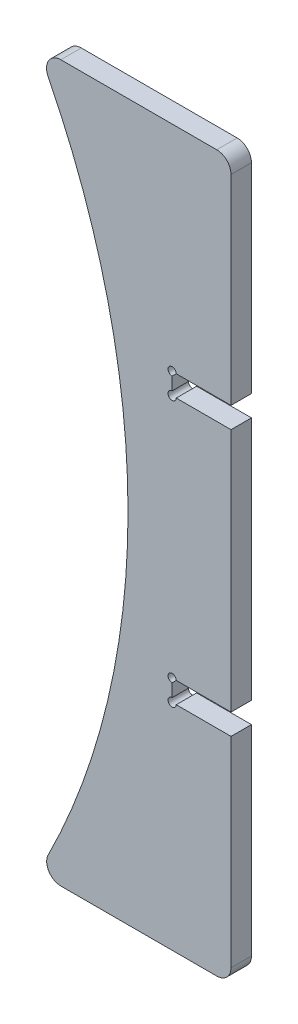
ISO-10303-21;
HEADER;
FILE_DESCRIPTION(('STEP AP214'),'2;1');
FILE_NAME('part.step','',(''),(''),'','','');
FILE_SCHEMA(('AUTOMOTIVE_DESIGN { 1 0 10303 214 1 1 1 1 }'));
ENDSEC;
DATA;
#1=APPLICATION_CONTEXT('core data for automotive mechanical design processes');
#2=APPLICATION_PROTOCOL_DEFINITION('international standard','automotive_design',2000,#1);
#3=PRODUCT_CONTEXT('',#1,'mechanical');
#4=PRODUCT('Part','Part','',(#3));
#5=PRODUCT_RELATED_PRODUCT_CATEGORY('part','',(#4));
#6=PRODUCT_DEFINITION_FORMATION('','',#4);
#7=PRODUCT_DEFINITION_CONTEXT('part definition',#1,'design');
#8=PRODUCT_DEFINITION('design','',#6,#7);
#9=PRODUCT_DEFINITION_SHAPE('','',#8);
#10=(LENGTH_UNIT() NAMED_UNIT(*) SI_UNIT(.MILLI.,.METRE.));
#11=(NAMED_UNIT(*) PLANE_ANGLE_UNIT() SI_UNIT($,.RADIAN.));
#12=(NAMED_UNIT(*) SI_UNIT($,.STERADIAN.) SOLID_ANGLE_UNIT());
#13=UNCERTAINTY_MEASURE_WITH_UNIT(LENGTH_MEASURE(1.E-05),#10,'distance_accuracy_value','');
#14=(GEOMETRIC_REPRESENTATION_CONTEXT(3) GLOBAL_UNCERTAINTY_ASSIGNED_CONTEXT((#13)) GLOBAL_UNIT_ASSIGNED_CONTEXT((#10,
#11,#12)) REPRESENTATION_CONTEXT('',''));
#15=CARTESIAN_POINT('',(0.,0.,0.));
#16=DIRECTION('',(0.,0.,1.));
#17=DIRECTION('',(1.,0.,0.));
#18=AXIS2_PLACEMENT_3D('',#15,#16,#17);
#19=CARTESIAN_POINT('',(-5.22263123628082,117.808229797163,-5.));
#20=DIRECTION('',(0.,0.,1.));
#21=DIRECTION('',(1.,0.,0.));
#22=AXIS2_PLACEMENT_3D('',#19,#20,#21);
#23=CYLINDRICAL_SURFACE('',#22,3.5);
#24=CARTESIAN_POINT('',(-5.22263123628082,117.808229797163,0.));
#25=DIRECTION('',(0.,0.,1.));
#26=DIRECTION('',(1.,0.,0.));
#27=AXIS2_PLACEMENT_3D('',#24,#25,#26);
#28=CIRCLE('',#27,3.5);
#29=CARTESIAN_POINT('',(-1.72263123628082,117.808229797163,0.));
#30=VERTEX_POINT('',#29);
#31=CARTESIAN_POINT('',(-5.22263123628082,121.308229797163,0.));
#32=VERTEX_POINT('',#31);
#33=EDGE_CURVE('E241',#30,#32,#28,.T.);
#34=ORIENTED_EDGE('',*,*,#33,.F.);
#35=DIRECTION('',(0.,0.,1.));
#36=VECTOR('',#35,1.);
#37=CARTESIAN_POINT('',(-1.72263123628082,117.808229797163,-5.));
#38=LINE('',#37,#36);
#39=CARTESIAN_POINT('',(-1.72263123628082,117.808229797163,-5.));
#40=VERTEX_POINT('',#39);
#41=EDGE_CURVE('E11',#40,#30,#38,.T.);
#42=ORIENTED_EDGE('',*,*,#41,.F.);
#43=CARTESIAN_POINT('',(-5.22263123628082,117.808229797163,-5.));
#44=DIRECTION('',(0.,0.,1.));
#45=DIRECTION('',(1.,0.,0.));
#46=AXIS2_PLACEMENT_3D('',#43,#44,#45);
#47=CIRCLE('',#46,3.5);
#48=CARTESIAN_POINT('',(-5.22263123628082,121.308229797163,-5.));
#49=VERTEX_POINT('',#48);
#50=EDGE_CURVE('E203',#40,#49,#47,.T.);
#51=ORIENTED_EDGE('',*,*,#50,.T.);
#52=DIRECTION('',(0.,0.,1.));
#53=VECTOR('',#52,1.);
#54=CARTESIAN_POINT('',(-5.22263123628082,121.308229797163,-5.));
#55=LINE('',#54,#53);
#56=EDGE_CURVE('E40',#49,#32,#55,.T.);
#57=ORIENTED_EDGE('',*,*,#56,.T.);
#58=EDGE_LOOP('',(#34,#42,#51,#57));
#59=FACE_BOUND('',#58,.T.);
#60=ADVANCED_FACE('F37',(#59),#23,.T.);
#61=CARTESIAN_POINT('',(-1.72263123628082,117.808229797163,-5.));
#62=DIRECTION('',(1.,0.,0.));
#63=DIRECTION('',(0.,1.,0.));
#64=AXIS2_PLACEMENT_3D('',#61,#62,#63);
#65=PLANE('',#64);
#66=DIRECTION('',(0.,1.,0.));
#67=VECTOR('',#66,1.);
#68=CARTESIAN_POINT('',(-1.72263123628082,117.808229797163,0.));
#69=LINE('',#68,#67);
#70=CARTESIAN_POINT('',(-1.72263123628056,68.8832302590771,0.));
#71=VERTEX_POINT('',#70);
#72=EDGE_CURVE('E196',#71,#30,#69,.T.);
#73=ORIENTED_EDGE('',*,*,#72,.F.);
#74=DIRECTION('',(0.,0.,1.));
#75=VECTOR('',#74,1.);
#76=CARTESIAN_POINT('',(-1.72263123628056,68.8832302590771,-5.));
#77=LINE('',#76,#75);
#78=CARTESIAN_POINT('',(-1.72263123628056,68.8832302590771,-5.));
#79=VERTEX_POINT('',#78);
#80=EDGE_CURVE('E45',#79,#71,#77,.T.);
#81=ORIENTED_EDGE('',*,*,#80,.F.);
#82=DIRECTION('',(0.,1.,0.));
#83=VECTOR('',#82,1.);
#84=CARTESIAN_POINT('',(-1.72263123628082,117.808229797163,-5.));
#85=LINE('',#84,#83);
#86=EDGE_CURVE('E228',#79,#40,#85,.T.);
#87=ORIENTED_EDGE('',*,*,#86,.T.);
#88=ORIENTED_EDGE('',*,*,#41,.T.);
#89=EDGE_LOOP('',(#73,#81,#87,#88));
#90=FACE_BOUND('',#89,.T.);
#91=ADVANCED_FACE('F368',(#90),#65,.T.);
#92=CARTESIAN_POINT('',(-1.72263123628056,68.8832302590771,-5.));
#93=DIRECTION('',(0.,-1.,0.));
#94=DIRECTION('',(0.,0.,-1.));
#95=AXIS2_PLACEMENT_3D('',#92,#93,#94);
#96=PLANE('',#95);
#97=DIRECTION('',(0.,0.,1.));
#98=VECTOR('',#97,1.);
#99=CARTESIAN_POINT('',(-15.1382280346836,68.8832302590771,-5.001));
#100=LINE('',#99,#98);
#101=CARTESIAN_POINT('',(-15.1382280346836,68.8832302590771,0.));
#102=VERTEX_POINT('',#101);
#103=CARTESIAN_POINT('',(-15.1382280346836,68.8832302590771,-5.));
#104=VERTEX_POINT('',#103);
#105=EDGE_CURVE('E53',#102,#104,#100,.F.);
#106=ORIENTED_EDGE('',*,*,#105,.T.);
#107=DIRECTION('',(1.,0.,0.));
#108=VECTOR('',#107,1.);
#109=CARTESIAN_POINT('',(-1.72263123628056,68.8832302590771,-5.));
#110=LINE('',#109,#108);
#111=EDGE_CURVE('E233',#104,#79,#110,.T.);
#112=ORIENTED_EDGE('',*,*,#111,.T.);
#113=ORIENTED_EDGE('',*,*,#80,.T.);
#114=DIRECTION('',(1.,0.,0.));
#115=VECTOR('',#114,1.);
#116=CARTESIAN_POINT('',(-1.72263123628056,68.8832302590771,0.));
#117=LINE('',#116,#115);
#118=EDGE_CURVE('E193',#102,#71,#117,.T.);
#119=ORIENTED_EDGE('',*,*,#118,.F.);
#120=EDGE_LOOP('',(#106,#112,#113,#119));
#121=FACE_BOUND('',#120,.T.);
#122=ADVANCED_FACE('F372',(#121),#96,.T.);
#123=CARTESIAN_POINT('',(-16.1382280346836,68.8832302590771,-5.));
#124=DIRECTION('',(1.,0.,0.));
#125=DIRECTION('',(0.,0.,-1.));
#126=AXIS2_PLACEMENT_3D('',#123,#124,#125);
#127=PLANE('',#126);
#128=DIRECTION('',(0.,0.,1.));
#129=VECTOR('',#128,1.);
#130=CARTESIAN_POINT('',(-16.1382280346836,67.8832302590771,-5.001));
#131=LINE('',#130,#129);
#132=CARTESIAN_POINT('',(-16.1382280346836,67.8832302590771,-5.));
#133=VERTEX_POINT('',#132);
#134=CARTESIAN_POINT('',(-16.1382280346836,67.8832302590771,0.));
#135=VERTEX_POINT('',#134);
#136=EDGE_CURVE('E174',#133,#135,#131,.T.);
#137=ORIENTED_EDGE('',*,*,#136,.T.);
#138=DIRECTION('',(0.,1.,0.));
#139=VECTOR('',#138,1.);
#140=CARTESIAN_POINT('',(-16.1382280346836,68.8832302590771,0.));
#141=LINE('',#140,#139);
#142=CARTESIAN_POINT('',(-16.1382280346836,64.7332302590771,0.));
#143=VERTEX_POINT('',#142);
#144=EDGE_CURVE('E185',#143,#135,#141,.T.);
#145=ORIENTED_EDGE('',*,*,#144,.F.);
#146=DIRECTION('',(0.,0.,1.));
#147=VECTOR('',#146,1.);
#148=CARTESIAN_POINT('',(-16.1382280346836,64.7332302590771,-5.001));
#149=LINE('',#148,#147);
#150=CARTESIAN_POINT('',(-16.1382280346836,64.7332302590771,-5.));
#151=VERTEX_POINT('',#150);
#152=EDGE_CURVE('E61',#143,#151,#149,.F.);
#153=ORIENTED_EDGE('',*,*,#152,.T.);
#154=DIRECTION('',(0.,1.,0.));
#155=VECTOR('',#154,1.);
#156=CARTESIAN_POINT('',(-16.1382280346836,68.8832302590771,-5.));
#157=LINE('',#156,#155);
#158=EDGE_CURVE('E187',#151,#133,#157,.T.);
#159=ORIENTED_EDGE('',*,*,#158,.T.);
#160=EDGE_LOOP('',(#137,#145,#153,#159));
#161=FACE_BOUND('',#160,.T.);
#162=ADVANCED_FACE('F184',(#161),#127,.T.);
#163=CARTESIAN_POINT('',(-16.1382280346836,63.7332302590771,-5.));
#164=DIRECTION('',(0.,1.,0.));
#165=DIRECTION('',(-1.,0.,0.));
#166=AXIS2_PLACEMENT_3D('',#163,#164,#165);
#167=PLANE('',#166);
#168=DIRECTION('',(0.,0.,1.));
#169=VECTOR('',#168,1.);
#170=CARTESIAN_POINT('',(-15.1382280346836,63.7332302590771,-5.001));
#171=LINE('',#170,#169);
#172=CARTESIAN_POINT('',(-15.1382280346836,63.7332302590771,-5.));
#173=VERTEX_POINT('',#172);
#174=CARTESIAN_POINT('',(-15.1382280346836,63.7332302590771,0.));
#175=VERTEX_POINT('',#174);
#176=EDGE_CURVE('E288',#173,#175,#171,.T.);
#177=ORIENTED_EDGE('',*,*,#176,.T.);
#178=DIRECTION('',(-1.,0.,0.));
#179=VECTOR('',#178,1.);
#180=CARTESIAN_POINT('',(-16.1382280346836,63.7332302590771,0.));
#181=LINE('',#180,#179);
#182=CARTESIAN_POINT('',(-1.72263123628056,63.7332302590771,0.));
#183=VERTEX_POINT('',#182);
#184=EDGE_CURVE('E194',#183,#175,#181,.T.);
#185=ORIENTED_EDGE('',*,*,#184,.F.);
#186=DIRECTION('',(0.,0.,1.));
#187=VECTOR('',#186,1.);
#188=CARTESIAN_POINT('',(-1.72263123628056,63.7332302590771,-5.));
#189=LINE('',#188,#187);
#190=CARTESIAN_POINT('',(-1.72263123628056,63.7332302590771,-5.));
#191=VERTEX_POINT('',#190);
#192=EDGE_CURVE('E207',#191,#183,#189,.T.);
#193=ORIENTED_EDGE('',*,*,#192,.F.);
#194=DIRECTION('',(-1.,0.,0.));
#195=VECTOR('',#194,1.);
#196=CARTESIAN_POINT('',(-16.1382280346836,63.7332302590771,-5.));
#197=LINE('',#196,#195);
#198=EDGE_CURVE('E289',#191,#173,#197,.T.);
#199=ORIENTED_EDGE('',*,*,#198,.T.);
#200=EDGE_LOOP('',(#177,#185,#193,#199));
#201=FACE_BOUND('',#200,.T.);
#202=ADVANCED_FACE('F287',(#201),#167,.T.);
#203=CARTESIAN_POINT('',(-1.72263123628056,63.7332302590771,-5.));
#204=DIRECTION('',(1.,0.,0.));
#205=DIRECTION('',(0.,1.,0.));
#206=AXIS2_PLACEMENT_3D('',#203,#204,#205);
#207=PLANE('',#206);
#208=DIRECTION('',(0.,1.,0.));
#209=VECTOR('',#208,1.);
#210=CARTESIAN_POINT('',(-1.72263123628056,63.7332302590771,0.));
#211=LINE('',#210,#209);
#212=CARTESIAN_POINT('',(-1.72263123628055,3.88322933520508,0.));
#213=VERTEX_POINT('',#212);
#214=EDGE_CURVE('E198',#213,#183,#211,.T.);
#215=ORIENTED_EDGE('',*,*,#214,.F.);
#216=DIRECTION('',(0.,0.,1.));
#217=VECTOR('',#216,1.);
#218=CARTESIAN_POINT('',(-1.72263123628055,3.88322933520508,-5.));
#219=LINE('',#218,#217);
#220=CARTESIAN_POINT('',(-1.72263123628055,3.88322933520508,-5.));
#221=VERTEX_POINT('',#220);
#222=EDGE_CURVE('E209',#221,#213,#219,.T.);
#223=ORIENTED_EDGE('',*,*,#222,.F.);
#224=DIRECTION('',(0.,1.,0.));
#225=VECTOR('',#224,1.);
#226=CARTESIAN_POINT('',(-1.72263123628056,63.7332302590771,-5.));
#227=LINE('',#226,#225);
#228=EDGE_CURVE('E282',#221,#191,#227,.T.);
#229=ORIENTED_EDGE('',*,*,#228,.T.);
#230=ORIENTED_EDGE('',*,*,#192,.T.);
#231=EDGE_LOOP('',(#215,#223,#229,#230));
#232=FACE_BOUND('',#231,.T.);
#233=ADVANCED_FACE('F279',(#232),#207,.T.);
#234=CARTESIAN_POINT('',(-1.72263123628055,3.88322933520508,-5.));
#235=DIRECTION('',(0.,-1.,0.));
#236=DIRECTION('',(1.,0.,0.));
#237=AXIS2_PLACEMENT_3D('',#234,#235,#236);
#238=PLANE('',#237);
#239=DIRECTION('',(0.,0.,1.));
#240=VECTOR('',#239,1.);
#241=CARTESIAN_POINT('',(-15.1382280346836,3.88322933520507,-5.001));
#242=LINE('',#241,#240);
#243=CARTESIAN_POINT('',(-15.1382280346836,3.88322933520507,0.));
#244=VERTEX_POINT('',#243);
#245=CARTESIAN_POINT('',(-15.1382280346836,3.88322933520507,-5.));
#246=VERTEX_POINT('',#245);
#247=EDGE_CURVE('E303',#244,#246,#242,.F.);
#248=ORIENTED_EDGE('',*,*,#247,.T.);
#249=DIRECTION('',(1.,0.,0.));
#250=VECTOR('',#249,1.);
#251=CARTESIAN_POINT('',(-1.72263123628055,3.88322933520508,-5.));
#252=LINE('',#251,#250);
#253=EDGE_CURVE('E344',#246,#221,#252,.T.);
#254=ORIENTED_EDGE('',*,*,#253,.T.);
#255=ORIENTED_EDGE('',*,*,#222,.T.);
#256=DIRECTION('',(1.,0.,0.));
#257=VECTOR('',#256,1.);
#258=CARTESIAN_POINT('',(-1.72263123628055,3.88322933520508,0.));
#259=LINE('',#258,#257);
#260=EDGE_CURVE('E271',#244,#213,#259,.T.);
#261=ORIENTED_EDGE('',*,*,#260,.F.);
#262=EDGE_LOOP('',(#248,#254,#255,#261));
#263=FACE_BOUND('',#262,.T.);
#264=ADVANCED_FACE('F349',(#263),#238,.T.);
#265=CARTESIAN_POINT('',(-16.1382280346836,3.88322933520507,-5.));
#266=DIRECTION('',(1.,0.,0.));
#267=DIRECTION('',(0.,0.,-1.));
#268=AXIS2_PLACEMENT_3D('',#265,#266,#267);
#269=PLANE('',#268);
#270=DIRECTION('',(0.,0.,1.));
#271=VECTOR('',#270,1.);
#272=CARTESIAN_POINT('',(-16.1382280346836,2.88322933520507,-5.001));
#273=LINE('',#272,#271);
#274=CARTESIAN_POINT('',(-16.1382280346836,2.88322933520507,-5.));
#275=VERTEX_POINT('',#274);
#276=CARTESIAN_POINT('',(-16.1382280346836,2.88322933520507,0.));
#277=VERTEX_POINT('',#276);
#278=EDGE_CURVE('E300',#275,#277,#273,.T.);
#279=ORIENTED_EDGE('',*,*,#278,.T.);
#280=DIRECTION('',(0.,1.,0.));
#281=VECTOR('',#280,1.);
#282=CARTESIAN_POINT('',(-16.1382280346836,3.88322933520507,0.));
#283=LINE('',#282,#281);
#284=CARTESIAN_POINT('',(-16.1382280346836,-0.266770664794927,0.));
#285=VERTEX_POINT('',#284);
#286=EDGE_CURVE('E268',#285,#277,#283,.T.);
#287=ORIENTED_EDGE('',*,*,#286,.F.);
#288=DIRECTION('',(0.,0.,1.));
#289=VECTOR('',#288,1.);
#290=CARTESIAN_POINT('',(-16.1382280346836,-0.266770664794924,-5.001));
#291=LINE('',#290,#289);
#292=CARTESIAN_POINT('',(-16.1382280346836,-0.266770664794924,-5.));
#293=VERTEX_POINT('',#292);
#294=EDGE_CURVE('E311',#285,#293,#291,.F.);
#295=ORIENTED_EDGE('',*,*,#294,.T.);
#296=DIRECTION('',(0.,1.,0.));
#297=VECTOR('',#296,1.);
#298=CARTESIAN_POINT('',(-16.1382280346836,3.88322933520507,-5.));
#299=LINE('',#298,#297);
#300=EDGE_CURVE('E341',#293,#275,#299,.T.);
#301=ORIENTED_EDGE('',*,*,#300,.T.);
#302=EDGE_LOOP('',(#279,#287,#295,#301));
#303=FACE_BOUND('',#302,.T.);
#304=ADVANCED_FACE('F411',(#303),#269,.T.);
#305=CARTESIAN_POINT('',(-16.1382280346836,-1.26677066479493,-5.));
#306=DIRECTION('',(0.,1.,0.));
#307=DIRECTION('',(-1.,0.,0.));
#308=AXIS2_PLACEMENT_3D('',#305,#306,#307);
#309=PLANE('',#308);
#310=DIRECTION('',(0.,0.,1.));
#311=VECTOR('',#310,1.);
#312=CARTESIAN_POINT('',(-15.1382280346836,-1.26677066479493,-5.001));
#313=LINE('',#312,#311);
#314=CARTESIAN_POINT('',(-15.1382280346836,-1.26677066479493,-5.));
#315=VERTEX_POINT('',#314);
#316=CARTESIAN_POINT('',(-15.1382280346836,-1.26677066479493,0.));
#317=VERTEX_POINT('',#316);
#318=EDGE_CURVE('E308',#315,#317,#313,.T.);
#319=ORIENTED_EDGE('',*,*,#318,.T.);
#320=DIRECTION('',(-1.,0.,0.));
#321=VECTOR('',#320,1.);
#322=CARTESIAN_POINT('',(-16.1382280346836,-1.26677066479493,0.));
#323=LINE('',#322,#321);
#324=CARTESIAN_POINT('',(-1.72263123628055,-1.26677066479493,0.));
#325=VERTEX_POINT('',#324);
#326=EDGE_CURVE('E265',#325,#317,#323,.T.);
#327=ORIENTED_EDGE('',*,*,#326,.F.);
#328=DIRECTION('',(0.,0.,1.));
#329=VECTOR('',#328,1.);
#330=CARTESIAN_POINT('',(-1.72263123628055,-1.26677066479493,-5.));
#331=LINE('',#330,#329);
#332=CARTESIAN_POINT('',(-1.72263123628055,-1.26677066479493,-5.));
#333=VERTEX_POINT('',#332);
#334=EDGE_CURVE('E212',#333,#325,#331,.T.);
#335=ORIENTED_EDGE('',*,*,#334,.F.);
#336=DIRECTION('',(-1.,0.,0.));
#337=VECTOR('',#336,1.);
#338=CARTESIAN_POINT('',(-16.1382280346836,-1.26677066479493,-5.));
#339=LINE('',#338,#337);
#340=EDGE_CURVE('E338',#333,#315,#339,.T.);
#341=ORIENTED_EDGE('',*,*,#340,.T.);
#342=EDGE_LOOP('',(#319,#327,#335,#341));
#343=FACE_BOUND('',#342,.T.);
#344=ADVANCED_FACE('F406',(#343),#309,.T.);
#345=CARTESIAN_POINT('',(-1.72263123628055,-1.26677066479493,-5.));
#346=DIRECTION('',(1.,0.,0.));
#347=DIRECTION('',(0.,1.,0.));
#348=AXIS2_PLACEMENT_3D('',#345,#346,#347);
#349=PLANE('',#348);
#350=DIRECTION('',(0.,1.,0.));
#351=VECTOR('',#350,1.);
#352=CARTESIAN_POINT('',(-1.72263123628055,-1.26677066479493,0.));
#353=LINE('',#352,#351);
#354=CARTESIAN_POINT('',(-1.72263123628055,-50.3156989133868,0.));
#355=VERTEX_POINT('',#354);
#356=EDGE_CURVE('E262',#355,#325,#353,.T.);
#357=ORIENTED_EDGE('',*,*,#356,.F.);
#358=DIRECTION('',(0.,0.,1.));
#359=VECTOR('',#358,1.);
#360=CARTESIAN_POINT('',(-1.72263123628055,-50.3156989133868,-5.));
#361=LINE('',#360,#359);
#362=CARTESIAN_POINT('',(-1.72263123628055,-50.3156989133868,-5.));
#363=VERTEX_POINT('',#362);
#364=EDGE_CURVE('E214',#363,#355,#361,.T.);
#365=ORIENTED_EDGE('',*,*,#364,.F.);
#366=DIRECTION('',(0.,1.,0.));
#367=VECTOR('',#366,1.);
#368=CARTESIAN_POINT('',(-1.72263123628055,-1.26677066479493,-5.));
#369=LINE('',#368,#367);
#370=EDGE_CURVE('E335',#363,#333,#369,.T.);
#371=ORIENTED_EDGE('',*,*,#370,.T.);
#372=ORIENTED_EDGE('',*,*,#334,.T.);
#373=EDGE_LOOP('',(#357,#365,#371,#372));
#374=FACE_BOUND('',#373,.T.);
#375=ADVANCED_FACE('F401',(#374),#349,.T.);
#376=CARTESIAN_POINT('',(-5.22263123628056,-50.3156989133868,-5.));
#377=DIRECTION('',(0.,0.,1.));
#378=DIRECTION('',(1.,0.,0.));
#379=AXIS2_PLACEMENT_3D('',#376,#377,#378);
#380=CYLINDRICAL_SURFACE('',#379,3.50000000000001);
#381=CARTESIAN_POINT('',(-5.22263123628056,-50.3156989133868,0.));
#382=DIRECTION('',(0.,0.,1.));
#383=DIRECTION('',(1.,0.,0.));
#384=AXIS2_PLACEMENT_3D('',#381,#382,#383);
#385=CIRCLE('',#384,3.50000000000001);
#386=CARTESIAN_POINT('',(-5.22263123628056,-53.8156989133868,0.));
#387=VERTEX_POINT('',#386);
#388=EDGE_CURVE('E259',#387,#355,#385,.T.);
#389=ORIENTED_EDGE('',*,*,#388,.F.);
#390=DIRECTION('',(0.,0.,1.));
#391=VECTOR('',#390,1.);
#392=CARTESIAN_POINT('',(-5.22263123628056,-53.8156989133868,-5.));
#393=LINE('',#392,#391);
#394=CARTESIAN_POINT('',(-5.22263123628056,-53.8156989133868,-5.));
#395=VERTEX_POINT('',#394);
#396=EDGE_CURVE('E216',#395,#387,#393,.T.);
#397=ORIENTED_EDGE('',*,*,#396,.F.);
#398=CARTESIAN_POINT('',(-5.22263123628056,-50.3156989133868,-5.));
#399=DIRECTION('',(0.,0.,1.));
#400=DIRECTION('',(1.,0.,0.));
#401=AXIS2_PLACEMENT_3D('',#398,#399,#400);
#402=CIRCLE('',#401,3.50000000000001);
#403=EDGE_CURVE('E332',#395,#363,#402,.T.);
#404=ORIENTED_EDGE('',*,*,#403,.T.);
#405=ORIENTED_EDGE('',*,*,#364,.T.);
#406=EDGE_LOOP('',(#389,#397,#404,#405));
#407=FACE_BOUND('',#406,.T.);
#408=ADVANCED_FACE('F397',(#407),#380,.T.);
#409=CARTESIAN_POINT('',(-5.22263123628056,-53.8156989133868,-5.));
#410=DIRECTION('',(0.,-1.,0.));
#411=DIRECTION('',(0.,0.,-1.));
#412=AXIS2_PLACEMENT_3D('',#409,#410,#411);
#413=PLANE('',#412);
#414=DIRECTION('',(1.,0.,0.));
#415=VECTOR('',#414,1.);
#416=CARTESIAN_POINT('',(-5.22263123628056,-53.8156989133868,0.));
#417=LINE('',#416,#415);
#418=CARTESIAN_POINT('',(-43.3386727500627,-53.8156989133868,0.));
#419=VERTEX_POINT('',#418);
#420=EDGE_CURVE('E256',#419,#387,#417,.T.);
#421=ORIENTED_EDGE('',*,*,#420,.F.);
#422=DIRECTION('',(0.,0.,1.));
#423=VECTOR('',#422,1.);
#424=CARTESIAN_POINT('',(-43.3386727500627,-53.8156989133868,-5.));
#425=LINE('',#424,#423);
#426=CARTESIAN_POINT('',(-43.3386727500627,-53.8156989133868,-5.));
#427=VERTEX_POINT('',#426);
#428=EDGE_CURVE('E218',#427,#419,#425,.T.);
#429=ORIENTED_EDGE('',*,*,#428,.F.);
#430=DIRECTION('',(1.,0.,0.));
#431=VECTOR('',#430,1.);
#432=CARTESIAN_POINT('',(-5.22263123628056,-53.8156989133868,-5.));
#433=LINE('',#432,#431);
#434=EDGE_CURVE('E329',#427,#395,#433,.T.);
#435=ORIENTED_EDGE('',*,*,#434,.T.);
#436=ORIENTED_EDGE('',*,*,#396,.T.);
#437=EDGE_LOOP('',(#421,#429,#435,#436));
#438=FACE_BOUND('',#437,.T.);
#439=ADVANCED_FACE('F393',(#438),#413,.T.);
#440=CARTESIAN_POINT('',(-43.3386727500628,-50.3156989133687,-5.));
#441=DIRECTION('',(0.,0.,1.));
#442=DIRECTION('',(1.,0.,0.));
#443=AXIS2_PLACEMENT_3D('',#440,#441,#442);
#444=CYLINDRICAL_SURFACE('',#443,3.50000000001808);
#445=CARTESIAN_POINT('',(-43.3386727500628,-50.3156989133687,0.));
#446=DIRECTION('',(0.,0.,1.));
#447=DIRECTION('',(1.,0.,0.));
#448=AXIS2_PLACEMENT_3D('',#445,#446,#447);
#449=CIRCLE('',#448,3.50000000001808);
#450=CARTESIAN_POINT('',(-46.587238263758,-49.0130776701223,0.));
#451=VERTEX_POINT('',#450);
#452=EDGE_CURVE('E253',#451,#419,#449,.T.);
#453=ORIENTED_EDGE('',*,*,#452,.F.);
#454=DIRECTION('',(0.,0.,1.));
#455=VECTOR('',#454,1.);
#456=CARTESIAN_POINT('',(-46.587238263758,-49.0130776701223,-5.));
#457=LINE('',#456,#455);
#458=CARTESIAN_POINT('',(-46.587238263758,-49.0130776701223,-5.));
#459=VERTEX_POINT('',#458);
#460=EDGE_CURVE('E220',#459,#451,#457,.T.);
#461=ORIENTED_EDGE('',*,*,#460,.F.);
#462=CARTESIAN_POINT('',(-43.3386727500628,-50.3156989133687,-5.));
#463=DIRECTION('',(0.,0.,1.));
#464=DIRECTION('',(1.,0.,0.));
#465=AXIS2_PLACEMENT_3D('',#462,#463,#464);
#466=CIRCLE('',#465,3.50000000001808);
#467=EDGE_CURVE('E326',#459,#427,#466,.T.);
#468=ORIENTED_EDGE('',*,*,#467,.T.);
#469=ORIENTED_EDGE('',*,*,#428,.T.);
#470=EDGE_LOOP('',(#453,#461,#468,#469));
#471=FACE_BOUND('',#470,.T.);
#472=ADVANCED_FACE('F389',(#471),#444,.T.);
#473=CARTESIAN_POINT('',(-210.789903212151,33.6991786242751,-5.));
#474=DIRECTION('',(0.,0.,1.));
#475=DIRECTION('',(1.,0.,0.));
#476=AXIS2_PLACEMENT_3D('',#473,#474,#475);
#477=CYLINDRICAL_SURFACE('',#476,183.858185886471);
#478=CARTESIAN_POINT('',(-210.789903212151,33.6991786242751,0.));
#479=DIRECTION('',(0.,0.,-1.));
#480=DIRECTION('',(1.,0.,0.));
#481=AXIS2_PLACEMENT_3D('',#478,#479,#480);
#482=CIRCLE('',#481,183.858185886471);
#483=CARTESIAN_POINT('',(-46.4994908206109,116.237005792683,0.));
#484=VERTEX_POINT('',#483);
#485=EDGE_CURVE('E250',#484,#451,#482,.T.);
#486=ORIENTED_EDGE('',*,*,#485,.F.);
#487=DIRECTION('',(0.,0.,1.));
#488=VECTOR('',#487,1.);
#489=CARTESIAN_POINT('',(-46.4994908206109,116.237005792683,-5.));
#490=LINE('',#489,#488);
#491=CARTESIAN_POINT('',(-46.4994908206109,116.237005792683,-5.));
#492=VERTEX_POINT('',#491);
#493=EDGE_CURVE('E222',#492,#484,#490,.T.);
#494=ORIENTED_EDGE('',*,*,#493,.F.);
#495=CARTESIAN_POINT('',(-210.789903212151,33.6991786242751,-5.));
#496=DIRECTION('',(0.,0.,-1.));
#497=DIRECTION('',(1.,0.,0.));
#498=AXIS2_PLACEMENT_3D('',#495,#496,#497);
#499=CIRCLE('',#498,183.858185886471);
#500=EDGE_CURVE('E323',#492,#459,#499,.T.);
#501=ORIENTED_EDGE('',*,*,#500,.T.);
#502=ORIENTED_EDGE('',*,*,#460,.T.);
#503=EDGE_LOOP('',(#486,#494,#501,#502));
#504=FACE_BOUND('',#503,.T.);
#505=ADVANCED_FACE('F385',(#504),#477,.F.);
#506=CARTESIAN_POINT('',(-43.371991000055,117.80822979718,-5.));
#507=DIRECTION('',(0.,0.,1.));
#508=DIRECTION('',(1.,0.,0.));
#509=AXIS2_PLACEMENT_3D('',#506,#507,#508);
#510=CYLINDRICAL_SURFACE('',#509,3.49999999998338);
#511=CARTESIAN_POINT('',(-43.371991000055,117.80822979718,0.));
#512=DIRECTION('',(0.,0.,1.));
#513=DIRECTION('',(1.,0.,0.));
#514=AXIS2_PLACEMENT_3D('',#511,#512,#513);
#515=CIRCLE('',#514,3.49999999998338);
#516=CARTESIAN_POINT('',(-43.371991000055,121.308229797163,0.));
#517=VERTEX_POINT('',#516);
#518=EDGE_CURVE('E247',#517,#484,#515,.T.);
#519=ORIENTED_EDGE('',*,*,#518,.F.);
#520=DIRECTION('',(0.,0.,1.));
#521=VECTOR('',#520,1.);
#522=CARTESIAN_POINT('',(-43.371991000055,121.308229797163,-5.));
#523=LINE('',#522,#521);
#524=CARTESIAN_POINT('',(-43.371991000055,121.308229797163,-5.));
#525=VERTEX_POINT('',#524);
#526=EDGE_CURVE('E223',#525,#517,#523,.T.);
#527=ORIENTED_EDGE('',*,*,#526,.F.);
#528=CARTESIAN_POINT('',(-43.371991000055,117.80822979718,-5.));
#529=DIRECTION('',(0.,0.,1.));
#530=DIRECTION('',(1.,0.,0.));
#531=AXIS2_PLACEMENT_3D('',#528,#529,#530);
#532=CIRCLE('',#531,3.49999999998338);
#533=EDGE_CURVE('E320',#525,#492,#532,.T.);
#534=ORIENTED_EDGE('',*,*,#533,.T.);
#535=ORIENTED_EDGE('',*,*,#493,.T.);
#536=EDGE_LOOP('',(#519,#527,#534,#535));
#537=FACE_BOUND('',#536,.T.);
#538=ADVANCED_FACE('F383',(#537),#510,.T.);
#539=CARTESIAN_POINT('',(-43.371991000055,121.308229797163,-5.));
#540=DIRECTION('',(0.,1.,0.));
#541=DIRECTION('',(-1.,0.,0.));
#542=AXIS2_PLACEMENT_3D('',#539,#540,#541);
#543=PLANE('',#542);
#544=DIRECTION('',(-1.,0.,0.));
#545=VECTOR('',#544,1.);
#546=CARTESIAN_POINT('',(-43.371991000055,121.308229797163,0.));
#547=LINE('',#546,#545);
#548=EDGE_CURVE('E244',#32,#517,#547,.T.);
#549=ORIENTED_EDGE('',*,*,#548,.F.);
#550=ORIENTED_EDGE('',*,*,#56,.F.);
#551=DIRECTION('',(-1.,0.,0.));
#552=VECTOR('',#551,1.);
#553=CARTESIAN_POINT('',(-43.371991000055,121.308229797163,-5.));
#554=LINE('',#553,#552);
#555=EDGE_CURVE('E318',#49,#525,#554,.T.);
#556=ORIENTED_EDGE('',*,*,#555,.T.);
#557=ORIENTED_EDGE('',*,*,#526,.T.);
#558=EDGE_LOOP('',(#549,#550,#556,#557));
#559=FACE_BOUND('',#558,.T.);
#560=ADVANCED_FACE('F380',(#559),#543,.T.);
#561=CARTESIAN_POINT('',(-5.22263123628082,117.808229797163,-5.));
#562=DIRECTION('',(0.,0.,1.));
#563=DIRECTION('',(1.,0.,0.));
#564=AXIS2_PLACEMENT_3D('',#561,#562,#563);
#565=PLANE('',#564);
#566=ORIENTED_EDGE('',*,*,#111,.F.);
#567=CARTESIAN_POINT('',(-16.1382280346836,68.8832302590771,-5.));
#568=DIRECTION('',(0.,0.,1.));
#569=DIRECTION('',(1.,0.,0.));
#570=AXIS2_PLACEMENT_3D('',#567,#568,#569);
#571=CIRCLE('',#570,1.);
#572=EDGE_CURVE('E179',#133,#104,#571,.F.);
#573=ORIENTED_EDGE('',*,*,#572,.F.);
#574=ORIENTED_EDGE('',*,*,#158,.F.);
#575=CARTESIAN_POINT('',(-16.1382280346836,63.7332302590771,-5.));
#576=DIRECTION('',(0.,0.,1.));
#577=DIRECTION('',(1.,0.,0.));
#578=AXIS2_PLACEMENT_3D('',#575,#576,#577);
#579=CIRCLE('',#578,1.);
#580=EDGE_CURVE('E188',#173,#151,#579,.F.);
#581=ORIENTED_EDGE('',*,*,#580,.F.);
#582=ORIENTED_EDGE('',*,*,#198,.F.);
#583=ORIENTED_EDGE('',*,*,#228,.F.);
#584=ORIENTED_EDGE('',*,*,#253,.F.);
#585=CARTESIAN_POINT('',(-16.1382280346836,3.88322933520507,-5.));
#586=DIRECTION('',(0.,0.,1.));
#587=DIRECTION('',(1.,0.,0.));
#588=AXIS2_PLACEMENT_3D('',#585,#586,#587);
#589=CIRCLE('',#588,1.);
#590=EDGE_CURVE('E291',#275,#246,#589,.F.);
#591=ORIENTED_EDGE('',*,*,#590,.F.);
#592=ORIENTED_EDGE('',*,*,#300,.F.);
#593=CARTESIAN_POINT('',(-16.1382280346836,-1.26677066479493,-5.));
#594=DIRECTION('',(0.,0.,1.));
#595=DIRECTION('',(1.,0.,0.));
#596=AXIS2_PLACEMENT_3D('',#593,#594,#595);
#597=CIRCLE('',#596,1.);
#598=EDGE_CURVE('E304',#315,#293,#597,.F.);
#599=ORIENTED_EDGE('',*,*,#598,.F.);
#600=ORIENTED_EDGE('',*,*,#340,.F.);
#601=ORIENTED_EDGE('',*,*,#370,.F.);
#602=ORIENTED_EDGE('',*,*,#403,.F.);
#603=ORIENTED_EDGE('',*,*,#434,.F.);
#604=ORIENTED_EDGE('',*,*,#467,.F.);
#605=ORIENTED_EDGE('',*,*,#500,.F.);
#606=ORIENTED_EDGE('',*,*,#533,.F.);
#607=ORIENTED_EDGE('',*,*,#555,.F.);
#608=ORIENTED_EDGE('',*,*,#50,.F.);
#609=ORIENTED_EDGE('',*,*,#86,.F.);
#610=EDGE_LOOP('',(#566,#573,#574,#581,#582,#583,#584,#591,#592,#599,#600,#601,#602,#603,#604,
#605,#606,#607,#608,#609));
#611=FACE_BOUND('',#610,.T.);
#612=ADVANCED_FACE('F353',(#611),#565,.F.);
#613=CARTESIAN_POINT('',(-5.22263123628082,117.808229797163,0.));
#614=DIRECTION('',(0.,0.,1.));
#615=DIRECTION('',(1.,0.,0.));
#616=AXIS2_PLACEMENT_3D('',#613,#614,#615);
#617=PLANE('',#616);
#618=CARTESIAN_POINT('',(-16.1382280346836,68.8832302590771,0.));
#619=DIRECTION('',(0.,0.,1.));
#620=DIRECTION('',(1.,0.,0.));
#621=AXIS2_PLACEMENT_3D('',#618,#619,#620);
#622=CIRCLE('',#621,1.);
#623=EDGE_CURVE('E171',#102,#135,#622,.T.);
#624=ORIENTED_EDGE('',*,*,#623,.F.);
#625=ORIENTED_EDGE('',*,*,#118,.T.);
#626=ORIENTED_EDGE('',*,*,#72,.T.);
#627=ORIENTED_EDGE('',*,*,#33,.T.);
#628=ORIENTED_EDGE('',*,*,#548,.T.);
#629=ORIENTED_EDGE('',*,*,#518,.T.);
#630=ORIENTED_EDGE('',*,*,#485,.T.);
#631=ORIENTED_EDGE('',*,*,#452,.T.);
#632=ORIENTED_EDGE('',*,*,#420,.T.);
#633=ORIENTED_EDGE('',*,*,#388,.T.);
#634=ORIENTED_EDGE('',*,*,#356,.T.);
#635=ORIENTED_EDGE('',*,*,#326,.T.);
#636=CARTESIAN_POINT('',(-16.1382280346836,-1.26677066479493,0.));
#637=DIRECTION('',(0.,0.,1.));
#638=DIRECTION('',(1.,0.,0.));
#639=AXIS2_PLACEMENT_3D('',#636,#637,#638);
#640=CIRCLE('',#639,1.);
#641=EDGE_CURVE('E314',#285,#317,#640,.T.);
#642=ORIENTED_EDGE('',*,*,#641,.F.);
#643=ORIENTED_EDGE('',*,*,#286,.T.);
#644=CARTESIAN_POINT('',(-16.1382280346836,3.88322933520507,0.));
#645=DIRECTION('',(0.,0.,1.));
#646=DIRECTION('',(1.,0.,0.));
#647=AXIS2_PLACEMENT_3D('',#644,#645,#646);
#648=CIRCLE('',#647,1.);
#649=EDGE_CURVE('E294',#244,#277,#648,.T.);
#650=ORIENTED_EDGE('',*,*,#649,.F.);
#651=ORIENTED_EDGE('',*,*,#260,.T.);
#652=ORIENTED_EDGE('',*,*,#214,.T.);
#653=ORIENTED_EDGE('',*,*,#184,.T.);
#654=CARTESIAN_POINT('',(-16.1382280346836,63.7332302590771,0.));
#655=DIRECTION('',(0.,0.,1.));
#656=DIRECTION('',(1.,0.,0.));
#657=AXIS2_PLACEMENT_3D('',#654,#655,#656);
#658=CIRCLE('',#657,1.);
#659=EDGE_CURVE('E192',#143,#175,#658,.T.);
#660=ORIENTED_EDGE('',*,*,#659,.F.);
#661=ORIENTED_EDGE('',*,*,#144,.T.);
#662=EDGE_LOOP('',(#624,#625,#626,#627,#628,#629,#630,#631,#632,#633,#634,#635,#642,#643,#650,
#651,#652,#653,#660,#661));
#663=FACE_BOUND('',#662,.T.);
#664=ADVANCED_FACE('F190',(#663),#617,.T.);
#665=CARTESIAN_POINT('',(-16.1382280346836,-1.26677066479493,-5.001));
#666=DIRECTION('',(0.,0.,1.));
#667=DIRECTION('',(1.,0.,0.));
#668=AXIS2_PLACEMENT_3D('',#665,#666,#667);
#669=CYLINDRICAL_SURFACE('',#668,1.);
#670=ORIENTED_EDGE('',*,*,#641,.T.);
#671=ORIENTED_EDGE('',*,*,#318,.F.);
#672=ORIENTED_EDGE('',*,*,#598,.T.);
#673=ORIENTED_EDGE('',*,*,#294,.F.);
#674=EDGE_LOOP('',(#670,#671,#672,#673));
#675=FACE_BOUND('',#674,.T.);
#676=ADVANCED_FACE('F364',(#675),#669,.F.);
#677=CARTESIAN_POINT('',(-16.1382280346836,3.88322933520507,-5.001));
#678=DIRECTION('',(0.,0.,1.));
#679=DIRECTION('',(1.,0.,0.));
#680=AXIS2_PLACEMENT_3D('',#677,#678,#679);
#681=CYLINDRICAL_SURFACE('',#680,1.);
#682=ORIENTED_EDGE('',*,*,#649,.T.);
#683=ORIENTED_EDGE('',*,*,#278,.F.);
#684=ORIENTED_EDGE('',*,*,#590,.T.);
#685=ORIENTED_EDGE('',*,*,#247,.F.);
#686=EDGE_LOOP('',(#682,#683,#684,#685));
#687=FACE_BOUND('',#686,.T.);
#688=ADVANCED_FACE('F357',(#687),#681,.F.);
#689=CARTESIAN_POINT('',(-16.1382280346836,63.7332302590771,-5.001));
#690=DIRECTION('',(0.,0.,1.));
#691=DIRECTION('',(1.,0.,0.));
#692=AXIS2_PLACEMENT_3D('',#689,#690,#691);
#693=CYLINDRICAL_SURFACE('',#692,1.);
#694=ORIENTED_EDGE('',*,*,#659,.T.);
#695=ORIENTED_EDGE('',*,*,#176,.F.);
#696=ORIENTED_EDGE('',*,*,#580,.T.);
#697=ORIENTED_EDGE('',*,*,#152,.F.);
#698=EDGE_LOOP('',(#694,#695,#696,#697));
#699=FACE_BOUND('',#698,.T.);
#700=ADVANCED_FACE('F355',(#699),#693,.F.);
#701=CARTESIAN_POINT('',(-16.1382280346836,68.8832302590771,-5.001));
#702=DIRECTION('',(0.,0.,1.));
#703=DIRECTION('',(1.,0.,0.));
#704=AXIS2_PLACEMENT_3D('',#701,#702,#703);
#705=CYLINDRICAL_SURFACE('',#704,1.);
#706=ORIENTED_EDGE('',*,*,#623,.T.);
#707=ORIENTED_EDGE('',*,*,#136,.F.);
#708=ORIENTED_EDGE('',*,*,#572,.T.);
#709=ORIENTED_EDGE('',*,*,#105,.F.);
#710=EDGE_LOOP('',(#706,#707,#708,#709));
#711=FACE_BOUND('',#710,.T.);
#712=ADVANCED_FACE('F173',(#711),#705,.F.);
#713=CLOSED_SHELL('',(#60,#91,#122,#162,#202,#233,#264,#304,#344,#375,#408,#439,#472,#505,#538,
#560,#612,#664,#676,#688,#700,#712));
#714=MANIFOLD_SOLID_BREP('B2',#713);
#715=ADVANCED_BREP_SHAPE_REPRESENTATION('',(#18,#714),#14);
#716=SHAPE_DEFINITION_REPRESENTATION(#9,#715);
ENDSEC;
END-ISO-10303-21;
